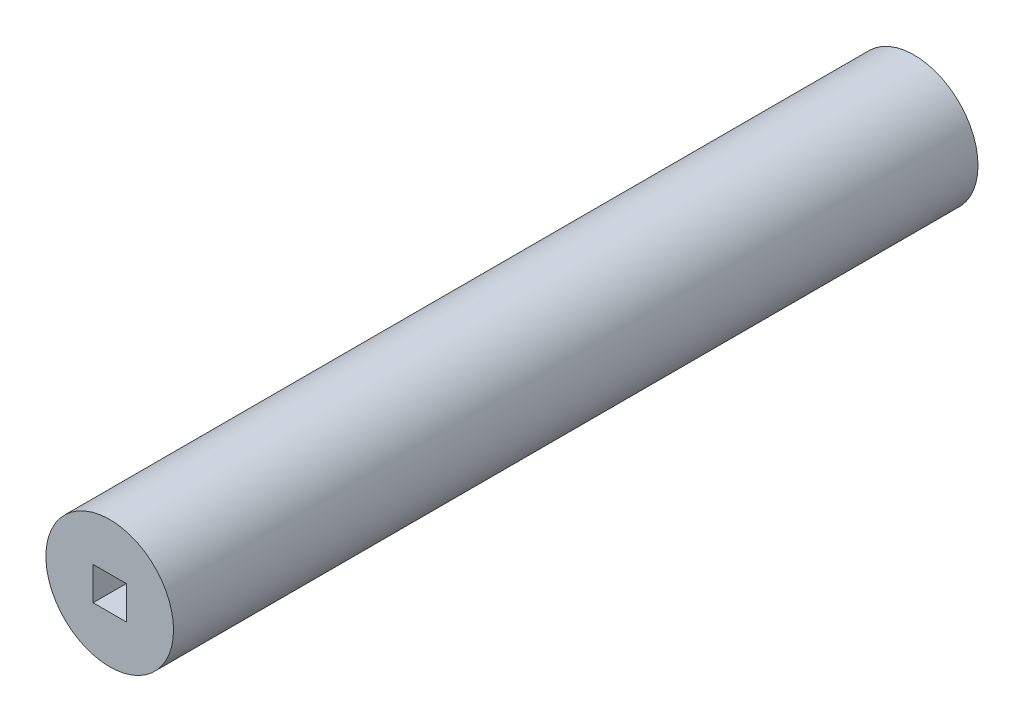
ISO-10303-21;
HEADER;
FILE_DESCRIPTION(('STEP AP214'),'2;1');
FILE_NAME('part.step','',(''),(''),'','','');
FILE_SCHEMA(('AUTOMOTIVE_DESIGN { 1 0 10303 214 1 1 1 1 }'));
ENDSEC;
DATA;
#1=APPLICATION_CONTEXT('core data for automotive mechanical design processes');
#2=APPLICATION_PROTOCOL_DEFINITION('international standard','automotive_design',2000,#1);
#3=PRODUCT_CONTEXT('',#1,'mechanical');
#4=PRODUCT('Part','Part','',(#3));
#5=PRODUCT_RELATED_PRODUCT_CATEGORY('part','',(#4));
#6=PRODUCT_DEFINITION_FORMATION('','',#4);
#7=PRODUCT_DEFINITION_CONTEXT('part definition',#1,'design');
#8=PRODUCT_DEFINITION('design','',#6,#7);
#9=PRODUCT_DEFINITION_SHAPE('','',#8);
#10=(LENGTH_UNIT() NAMED_UNIT(*) SI_UNIT(.MILLI.,.METRE.));
#11=(NAMED_UNIT(*) PLANE_ANGLE_UNIT() SI_UNIT($,.RADIAN.));
#12=(NAMED_UNIT(*) SI_UNIT($,.STERADIAN.) SOLID_ANGLE_UNIT());
#13=UNCERTAINTY_MEASURE_WITH_UNIT(LENGTH_MEASURE(1.E-05),#10,'distance_accuracy_value','');
#14=(GEOMETRIC_REPRESENTATION_CONTEXT(3) GLOBAL_UNCERTAINTY_ASSIGNED_CONTEXT((#13)) GLOBAL_UNIT_ASSIGNED_CONTEXT((#10,
#11,#12)) REPRESENTATION_CONTEXT('',''));
#15=CARTESIAN_POINT('',(0.,0.,0.));
#16=DIRECTION('',(0.,0.,1.));
#17=DIRECTION('',(1.,0.,0.));
#18=AXIS2_PLACEMENT_3D('',#15,#16,#17);
#19=CARTESIAN_POINT('',(0.,0.,75.));
#20=DIRECTION('',(0.,0.,-1.));
#21=DIRECTION('',(-1.,0.,0.));
#22=AXIS2_PLACEMENT_3D('',#19,#20,#21);
#23=CYLINDRICAL_SURFACE('',#22,5.95);
#24=CARTESIAN_POINT('',(0.,0.,75.));
#25=DIRECTION('',(0.,0.,1.));
#26=DIRECTION('',(1.,0.,0.));
#27=AXIS2_PLACEMENT_3D('',#24,#25,#26);
#28=CIRCLE('',#27,5.95);
#29=CARTESIAN_POINT('',(5.95,0.,75.));
#30=VERTEX_POINT('',#29);
#31=EDGE_CURVE('E11',#30,#30,#28,.T.);
#32=ORIENTED_EDGE('',*,*,#31,.F.);
#33=EDGE_LOOP('',(#32));
#34=FACE_BOUND('',#33,.T.);
#35=CARTESIAN_POINT('',(0.,0.,0.));
#36=DIRECTION('',(0.,0.,1.));
#37=DIRECTION('',(1.,0.,0.));
#38=AXIS2_PLACEMENT_3D('',#35,#36,#37);
#39=CIRCLE('',#38,5.95);
#40=CARTESIAN_POINT('',(5.95,0.,0.));
#41=VERTEX_POINT('',#40);
#42=EDGE_CURVE('E42',#41,#41,#39,.T.);
#43=ORIENTED_EDGE('',*,*,#42,.T.);
#44=EDGE_LOOP('',(#43));
#45=FACE_BOUND('',#44,.T.);
#46=ADVANCED_FACE('F39',(#34,#45),#23,.T.);
#47=CARTESIAN_POINT('',(0.,0.,75.));
#48=DIRECTION('',(0.,0.,1.));
#49=DIRECTION('',(1.,0.,0.));
#50=AXIS2_PLACEMENT_3D('',#47,#48,#49);
#51=PLANE('',#50);
#52=DIRECTION('',(0.,1.,0.));
#53=VECTOR('',#52,1.);
#54=CARTESIAN_POINT('',(-1.55,-1.55,75.));
#55=LINE('',#54,#53);
#56=CARTESIAN_POINT('',(-1.55,-1.55,75.));
#57=VERTEX_POINT('',#56);
#58=CARTESIAN_POINT('',(-1.55,1.55,75.));
#59=VERTEX_POINT('',#58);
#60=EDGE_CURVE('E81',#57,#59,#55,.T.);
#61=ORIENTED_EDGE('',*,*,#60,.T.);
#62=DIRECTION('',(1.,0.,0.));
#63=VECTOR('',#62,1.);
#64=CARTESIAN_POINT('',(1.55,1.55,75.));
#65=LINE('',#64,#63);
#66=CARTESIAN_POINT('',(1.55,1.55,75.));
#67=VERTEX_POINT('',#66);
#68=EDGE_CURVE('E90',#59,#67,#65,.T.);
#69=ORIENTED_EDGE('',*,*,#68,.T.);
#70=DIRECTION('',(0.,-1.,0.));
#71=VECTOR('',#70,1.);
#72=CARTESIAN_POINT('',(1.55,-1.55,75.));
#73=LINE('',#72,#71);
#74=CARTESIAN_POINT('',(1.55,-1.55,75.));
#75=VERTEX_POINT('',#74);
#76=EDGE_CURVE('E53',#67,#75,#73,.T.);
#77=ORIENTED_EDGE('',*,*,#76,.T.);
#78=DIRECTION('',(-1.,0.,0.));
#79=VECTOR('',#78,1.);
#80=CARTESIAN_POINT('',(1.55,-1.55,75.));
#81=LINE('',#80,#79);
#82=EDGE_CURVE('E87',#75,#57,#81,.T.);
#83=ORIENTED_EDGE('',*,*,#82,.T.);
#84=EDGE_LOOP('',(#61,#69,#77,#83));
#85=FACE_BOUND('',#84,.T.);
#86=ORIENTED_EDGE('',*,*,#31,.T.);
#87=EDGE_LOOP('',(#86));
#88=FACE_BOUND('',#87,.T.);
#89=ADVANCED_FACE('F94',(#85,#88),#51,.T.);
#90=CARTESIAN_POINT('',(0.,0.,0.));
#91=DIRECTION('',(0.,0.,1.));
#92=DIRECTION('',(1.,0.,0.));
#93=AXIS2_PLACEMENT_3D('',#90,#91,#92);
#94=PLANE('',#93);
#95=DIRECTION('',(1.,0.,0.));
#96=VECTOR('',#95,1.);
#97=CARTESIAN_POINT('',(1.55,1.55,0.));
#98=LINE('',#97,#96);
#99=CARTESIAN_POINT('',(-1.55,1.55,0.));
#100=VERTEX_POINT('',#99);
#101=CARTESIAN_POINT('',(1.55,1.55,0.));
#102=VERTEX_POINT('',#101);
#103=EDGE_CURVE('E106',#100,#102,#98,.T.);
#104=ORIENTED_EDGE('',*,*,#103,.F.);
#105=DIRECTION('',(0.,1.,0.));
#106=VECTOR('',#105,1.);
#107=CARTESIAN_POINT('',(-1.55,-1.55,0.));
#108=LINE('',#107,#106);
#109=CARTESIAN_POINT('',(-1.55,-1.55,0.));
#110=VERTEX_POINT('',#109);
#111=EDGE_CURVE('E61',#110,#100,#108,.T.);
#112=ORIENTED_EDGE('',*,*,#111,.F.);
#113=DIRECTION('',(-1.,0.,0.));
#114=VECTOR('',#113,1.);
#115=CARTESIAN_POINT('',(1.55,-1.55,0.));
#116=LINE('',#115,#114);
#117=CARTESIAN_POINT('',(1.55,-1.55,0.));
#118=VERTEX_POINT('',#117);
#119=EDGE_CURVE('E97',#118,#110,#116,.T.);
#120=ORIENTED_EDGE('',*,*,#119,.F.);
#121=DIRECTION('',(0.,-1.,0.));
#122=VECTOR('',#121,1.);
#123=CARTESIAN_POINT('',(1.55,-1.55,0.));
#124=LINE('',#123,#122);
#125=EDGE_CURVE('E100',#102,#118,#124,.T.);
#126=ORIENTED_EDGE('',*,*,#125,.F.);
#127=EDGE_LOOP('',(#104,#112,#120,#126));
#128=FACE_BOUND('',#127,.T.);
#129=ORIENTED_EDGE('',*,*,#42,.F.);
#130=EDGE_LOOP('',(#129));
#131=FACE_BOUND('',#130,.T.);
#132=ADVANCED_FACE('F118',(#128,#131),#94,.F.);
#133=CARTESIAN_POINT('',(-1.55,-1.55,75.));
#134=DIRECTION('',(-1.,0.,0.));
#135=DIRECTION('',(0.,0.,1.));
#136=AXIS2_PLACEMENT_3D('',#133,#134,#135);
#137=PLANE('',#136);
#138=ORIENTED_EDGE('',*,*,#111,.T.);
#139=DIRECTION('',(0.,0.,-1.));
#140=VECTOR('',#139,1.);
#141=CARTESIAN_POINT('',(-1.55,1.55,75.));
#142=LINE('',#141,#140);
#143=EDGE_CURVE('E77',#59,#100,#142,.T.);
#144=ORIENTED_EDGE('',*,*,#143,.F.);
#145=ORIENTED_EDGE('',*,*,#60,.F.);
#146=DIRECTION('',(0.,0.,-1.));
#147=VECTOR('',#146,1.);
#148=CARTESIAN_POINT('',(-1.55,-1.55,75.));
#149=LINE('',#148,#147);
#150=EDGE_CURVE('E110',#57,#110,#149,.T.);
#151=ORIENTED_EDGE('',*,*,#150,.T.);
#152=EDGE_LOOP('',(#138,#144,#145,#151));
#153=FACE_BOUND('',#152,.T.);
#154=ADVANCED_FACE('F79',(#153),#137,.F.);
#155=CARTESIAN_POINT('',(1.55,-1.55,75.));
#156=DIRECTION('',(0.,-1.,0.));
#157=DIRECTION('',(0.,0.,-1.));
#158=AXIS2_PLACEMENT_3D('',#155,#156,#157);
#159=PLANE('',#158);
#160=ORIENTED_EDGE('',*,*,#119,.T.);
#161=ORIENTED_EDGE('',*,*,#150,.F.);
#162=ORIENTED_EDGE('',*,*,#82,.F.);
#163=DIRECTION('',(0.,0.,-1.));
#164=VECTOR('',#163,1.);
#165=CARTESIAN_POINT('',(1.55,-1.55,75.));
#166=LINE('',#165,#164);
#167=EDGE_CURVE('E112',#75,#118,#166,.T.);
#168=ORIENTED_EDGE('',*,*,#167,.T.);
#169=EDGE_LOOP('',(#160,#161,#162,#168));
#170=FACE_BOUND('',#169,.T.);
#171=ADVANCED_FACE('F121',(#170),#159,.F.);
#172=CARTESIAN_POINT('',(1.55,-1.55,75.));
#173=DIRECTION('',(1.,0.,0.));
#174=DIRECTION('',(0.,0.,-1.));
#175=AXIS2_PLACEMENT_3D('',#172,#173,#174);
#176=PLANE('',#175);
#177=ORIENTED_EDGE('',*,*,#125,.T.);
#178=ORIENTED_EDGE('',*,*,#167,.F.);
#179=ORIENTED_EDGE('',*,*,#76,.F.);
#180=DIRECTION('',(0.,0.,-1.));
#181=VECTOR('',#180,1.);
#182=CARTESIAN_POINT('',(1.55,1.55,75.));
#183=LINE('',#182,#181);
#184=EDGE_CURVE('E86',#67,#102,#183,.T.);
#185=ORIENTED_EDGE('',*,*,#184,.T.);
#186=EDGE_LOOP('',(#177,#178,#179,#185));
#187=FACE_BOUND('',#186,.T.);
#188=ADVANCED_FACE('F114',(#187),#176,.F.);
#189=CARTESIAN_POINT('',(1.55,1.55,75.));
#190=DIRECTION('',(0.,1.,0.));
#191=DIRECTION('',(0.,0.,1.));
#192=AXIS2_PLACEMENT_3D('',#189,#190,#191);
#193=PLANE('',#192);
#194=ORIENTED_EDGE('',*,*,#103,.T.);
#195=ORIENTED_EDGE('',*,*,#184,.F.);
#196=ORIENTED_EDGE('',*,*,#68,.F.);
#197=ORIENTED_EDGE('',*,*,#143,.T.);
#198=EDGE_LOOP('',(#194,#195,#196,#197));
#199=FACE_BOUND('',#198,.T.);
#200=ADVANCED_FACE('F91',(#199),#193,.F.);
#201=CLOSED_SHELL('',(#46,#89,#132,#154,#171,#188,#200));
#202=MANIFOLD_SOLID_BREP('B2',#201);
#203=ADVANCED_BREP_SHAPE_REPRESENTATION('',(#18,#202),#14);
#204=SHAPE_DEFINITION_REPRESENTATION(#9,#203);
ENDSEC;
END-ISO-10303-21;
